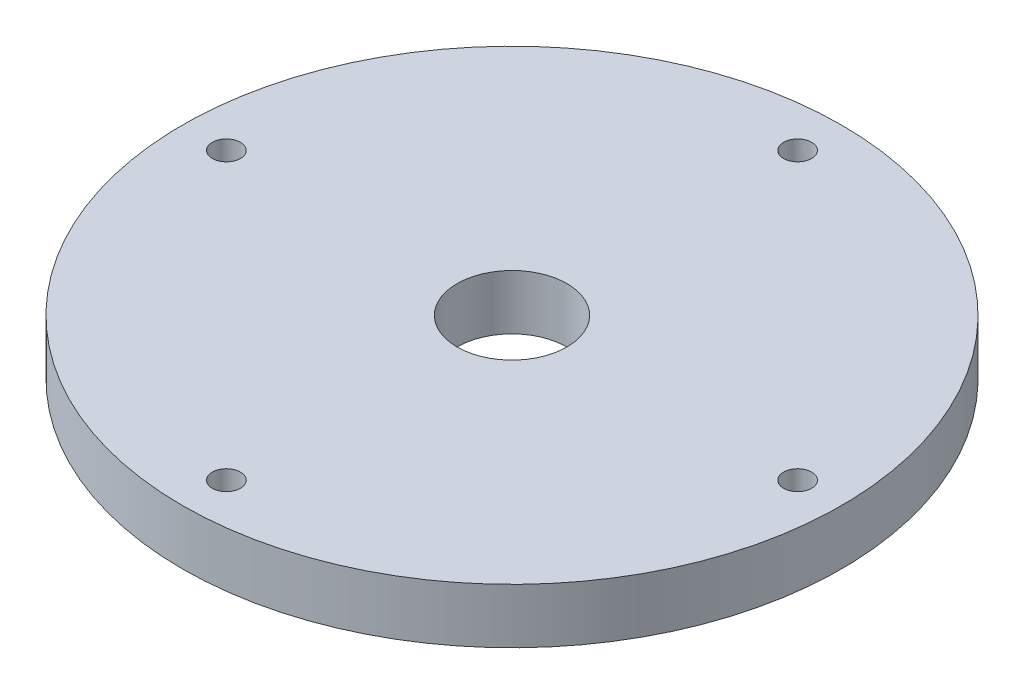
ISO-10303-21;
HEADER;
FILE_DESCRIPTION(('STEP AP214'),'2;1');
FILE_NAME('part.step','',(''),(''),'','','');
FILE_SCHEMA(('AUTOMOTIVE_DESIGN { 1 0 10303 214 1 1 1 1 }'));
ENDSEC;
DATA;
#1=APPLICATION_CONTEXT('core data for automotive mechanical design processes');
#2=APPLICATION_PROTOCOL_DEFINITION('international standard','automotive_design',2000,#1);
#3=PRODUCT_CONTEXT('',#1,'mechanical');
#4=PRODUCT('Part','Part','',(#3));
#5=PRODUCT_RELATED_PRODUCT_CATEGORY('part','',(#4));
#6=PRODUCT_DEFINITION_FORMATION('','',#4);
#7=PRODUCT_DEFINITION_CONTEXT('part definition',#1,'design');
#8=PRODUCT_DEFINITION('design','',#6,#7);
#9=PRODUCT_DEFINITION_SHAPE('','',#8);
#10=(LENGTH_UNIT() NAMED_UNIT(*) SI_UNIT(.MILLI.,.METRE.));
#11=(NAMED_UNIT(*) PLANE_ANGLE_UNIT() SI_UNIT($,.RADIAN.));
#12=(NAMED_UNIT(*) SI_UNIT($,.STERADIAN.) SOLID_ANGLE_UNIT());
#13=UNCERTAINTY_MEASURE_WITH_UNIT(LENGTH_MEASURE(1.E-05),#10,'distance_accuracy_value','');
#14=(GEOMETRIC_REPRESENTATION_CONTEXT(3) GLOBAL_UNCERTAINTY_ASSIGNED_CONTEXT((#13)) GLOBAL_UNIT_ASSIGNED_CONTEXT((#10,
#11,#12)) REPRESENTATION_CONTEXT('',''));
#15=CARTESIAN_POINT('',(0.,0.,0.));
#16=DIRECTION('',(0.,0.,1.));
#17=DIRECTION('',(1.,0.,0.));
#18=AXIS2_PLACEMENT_3D('',#15,#16,#17);
#19=CARTESIAN_POINT('',(0.,6.35,0.));
#20=DIRECTION('',(0.,1.,0.));
#21=DIRECTION('',(0.,0.,1.));
#22=AXIS2_PLACEMENT_3D('',#19,#20,#21);
#23=PLANE('',#22);
#24=CARTESIAN_POINT('',(0.,6.35,33.02));
#25=DIRECTION('',(0.,1.,0.));
#26=DIRECTION('',(0.,0.,1.));
#27=AXIS2_PLACEMENT_3D('',#24,#25,#26);
#28=CIRCLE('',#27,1.6256);
#29=CARTESIAN_POINT('',(0.,6.35,34.6456));
#30=VERTEX_POINT('',#29);
#31=EDGE_CURVE('E59',#30,#30,#28,.T.);
#32=ORIENTED_EDGE('',*,*,#31,.F.);
#33=EDGE_LOOP('',(#32));
#34=FACE_BOUND('',#33,.T.);
#35=CARTESIAN_POINT('',(0.,6.35,0.));
#36=DIRECTION('',(0.,1.,0.));
#37=DIRECTION('',(0.,0.,1.));
#38=AXIS2_PLACEMENT_3D('',#35,#36,#37);
#39=CIRCLE('',#38,6.35);
#40=CARTESIAN_POINT('',(0.,6.35,6.35));
#41=VERTEX_POINT('',#40);
#42=EDGE_CURVE('E47',#41,#41,#39,.T.);
#43=ORIENTED_EDGE('',*,*,#42,.F.);
#44=EDGE_LOOP('',(#43));
#45=FACE_BOUND('',#44,.T.);
#46=CARTESIAN_POINT('',(0.,6.35,0.));
#47=DIRECTION('',(0.,1.,0.));
#48=DIRECTION('',(0.,0.,1.));
#49=AXIS2_PLACEMENT_3D('',#46,#47,#48);
#50=CIRCLE('',#49,38.1);
#51=CARTESIAN_POINT('',(0.,6.35,38.1));
#52=VERTEX_POINT('',#51);
#53=EDGE_CURVE('E10',#52,#52,#50,.T.);
#54=ORIENTED_EDGE('',*,*,#53,.T.);
#55=EDGE_LOOP('',(#54));
#56=FACE_BOUND('',#55,.T.);
#57=CARTESIAN_POINT('',(0.,6.35,-33.02));
#58=DIRECTION('',(0.,1.,0.));
#59=DIRECTION('',(0.,0.,1.));
#60=AXIS2_PLACEMENT_3D('',#57,#58,#59);
#61=CIRCLE('',#60,1.6256);
#62=CARTESIAN_POINT('',(0.,6.35,-31.3944));
#63=VERTEX_POINT('',#62);
#64=EDGE_CURVE('E42',#63,#63,#61,.T.);
#65=ORIENTED_EDGE('',*,*,#64,.F.);
#66=EDGE_LOOP('',(#65));
#67=FACE_BOUND('',#66,.T.);
#68=CARTESIAN_POINT('',(33.02,6.35,0.));
#69=DIRECTION('',(0.,1.,0.));
#70=DIRECTION('',(0.,0.,1.));
#71=AXIS2_PLACEMENT_3D('',#68,#69,#70);
#72=CIRCLE('',#71,1.6256);
#73=CARTESIAN_POINT('',(33.02,6.35,1.62559999999999));
#74=VERTEX_POINT('',#73);
#75=EDGE_CURVE('E53',#74,#74,#72,.T.);
#76=ORIENTED_EDGE('',*,*,#75,.F.);
#77=EDGE_LOOP('',(#76));
#78=FACE_BOUND('',#77,.T.);
#79=CARTESIAN_POINT('',(-33.02,6.35,0.));
#80=DIRECTION('',(0.,1.,0.));
#81=DIRECTION('',(0.,0.,1.));
#82=AXIS2_PLACEMENT_3D('',#79,#80,#81);
#83=CIRCLE('',#82,1.6256);
#84=CARTESIAN_POINT('',(-33.02,6.35,1.6256));
#85=VERTEX_POINT('',#84);
#86=EDGE_CURVE('E65',#85,#85,#83,.T.);
#87=ORIENTED_EDGE('',*,*,#86,.F.);
#88=EDGE_LOOP('',(#87));
#89=FACE_BOUND('',#88,.T.);
#90=ADVANCED_FACE('F31',(#34,#45,#56,#67,#78,#89),#23,.T.);
#91=CARTESIAN_POINT('',(0.,0.,0.));
#92=DIRECTION('',(0.,1.,0.));
#93=DIRECTION('',(0.,0.,1.));
#94=AXIS2_PLACEMENT_3D('',#91,#92,#93);
#95=PLANE('',#94);
#96=CARTESIAN_POINT('',(0.,0.,33.02));
#97=DIRECTION('',(0.,1.,0.));
#98=DIRECTION('',(0.,0.,1.));
#99=AXIS2_PLACEMENT_3D('',#96,#97,#98);
#100=CIRCLE('',#99,1.6256);
#101=CARTESIAN_POINT('',(0.,0.,34.6456));
#102=VERTEX_POINT('',#101);
#103=EDGE_CURVE('E62',#102,#102,#100,.T.);
#104=ORIENTED_EDGE('',*,*,#103,.T.);
#105=EDGE_LOOP('',(#104));
#106=FACE_BOUND('',#105,.T.);
#107=CARTESIAN_POINT('',(0.,0.,0.));
#108=DIRECTION('',(0.,1.,0.));
#109=DIRECTION('',(0.,0.,1.));
#110=AXIS2_PLACEMENT_3D('',#107,#108,#109);
#111=CIRCLE('',#110,6.35);
#112=CARTESIAN_POINT('',(0.,0.,6.35));
#113=VERTEX_POINT('',#112);
#114=EDGE_CURVE('E50',#113,#113,#111,.T.);
#115=ORIENTED_EDGE('',*,*,#114,.T.);
#116=EDGE_LOOP('',(#115));
#117=FACE_BOUND('',#116,.T.);
#118=CARTESIAN_POINT('',(0.,0.,0.));
#119=DIRECTION('',(0.,1.,0.));
#120=DIRECTION('',(0.,0.,1.));
#121=AXIS2_PLACEMENT_3D('',#118,#119,#120);
#122=CIRCLE('',#121,38.1);
#123=CARTESIAN_POINT('',(0.,0.,38.1));
#124=VERTEX_POINT('',#123);
#125=EDGE_CURVE('E35',#124,#124,#122,.T.);
#126=ORIENTED_EDGE('',*,*,#125,.F.);
#127=EDGE_LOOP('',(#126));
#128=FACE_BOUND('',#127,.T.);
#129=CARTESIAN_POINT('',(0.,0.,-33.02));
#130=DIRECTION('',(0.,1.,0.));
#131=DIRECTION('',(0.,0.,1.));
#132=AXIS2_PLACEMENT_3D('',#129,#130,#131);
#133=CIRCLE('',#132,1.6256);
#134=CARTESIAN_POINT('',(0.,0.,-31.3944));
#135=VERTEX_POINT('',#134);
#136=EDGE_CURVE('E44',#135,#135,#133,.T.);
#137=ORIENTED_EDGE('',*,*,#136,.T.);
#138=EDGE_LOOP('',(#137));
#139=FACE_BOUND('',#138,.T.);
#140=CARTESIAN_POINT('',(33.02,0.,0.));
#141=DIRECTION('',(0.,1.,0.));
#142=DIRECTION('',(0.,0.,1.));
#143=AXIS2_PLACEMENT_3D('',#140,#141,#142);
#144=CIRCLE('',#143,1.6256);
#145=CARTESIAN_POINT('',(33.02,0.,1.62559999999999));
#146=VERTEX_POINT('',#145);
#147=EDGE_CURVE('E56',#146,#146,#144,.T.);
#148=ORIENTED_EDGE('',*,*,#147,.T.);
#149=EDGE_LOOP('',(#148));
#150=FACE_BOUND('',#149,.T.);
#151=CARTESIAN_POINT('',(-33.02,0.,0.));
#152=DIRECTION('',(0.,1.,0.));
#153=DIRECTION('',(0.,0.,1.));
#154=AXIS2_PLACEMENT_3D('',#151,#152,#153);
#155=CIRCLE('',#154,1.6256);
#156=CARTESIAN_POINT('',(-33.02,0.,1.6256));
#157=VERTEX_POINT('',#156);
#158=EDGE_CURVE('E68',#157,#157,#155,.T.);
#159=ORIENTED_EDGE('',*,*,#158,.T.);
#160=EDGE_LOOP('',(#159));
#161=FACE_BOUND('',#160,.T.);
#162=ADVANCED_FACE('F78',(#106,#117,#128,#139,#150,#161),#95,.F.);
#163=CARTESIAN_POINT('',(0.,6.35,0.));
#164=DIRECTION('',(0.,-1.,0.));
#165=DIRECTION('',(0.,0.,-1.));
#166=AXIS2_PLACEMENT_3D('',#163,#164,#165);
#167=CYLINDRICAL_SURFACE('',#166,38.1);
#168=ORIENTED_EDGE('',*,*,#53,.F.);
#169=EDGE_LOOP('',(#168));
#170=FACE_BOUND('',#169,.T.);
#171=ORIENTED_EDGE('',*,*,#125,.T.);
#172=EDGE_LOOP('',(#171));
#173=FACE_BOUND('',#172,.T.);
#174=ADVANCED_FACE('F33',(#170,#173),#167,.T.);
#175=CARTESIAN_POINT('',(0.,6.35,-33.02));
#176=DIRECTION('',(0.,-1.,0.));
#177=DIRECTION('',(0.,0.,-1.));
#178=AXIS2_PLACEMENT_3D('',#175,#176,#177);
#179=CYLINDRICAL_SURFACE('',#178,1.6256);
#180=ORIENTED_EDGE('',*,*,#64,.T.);
#181=EDGE_LOOP('',(#180));
#182=FACE_BOUND('',#181,.T.);
#183=ORIENTED_EDGE('',*,*,#136,.F.);
#184=EDGE_LOOP('',(#183));
#185=FACE_BOUND('',#184,.T.);
#186=ADVANCED_FACE('F88',(#182,#185),#179,.F.);
#187=CARTESIAN_POINT('',(0.,6.35,0.));
#188=DIRECTION('',(0.,-1.,0.));
#189=DIRECTION('',(0.,0.,-1.));
#190=AXIS2_PLACEMENT_3D('',#187,#188,#189);
#191=CYLINDRICAL_SURFACE('',#190,6.35);
#192=ORIENTED_EDGE('',*,*,#42,.T.);
#193=EDGE_LOOP('',(#192));
#194=FACE_BOUND('',#193,.T.);
#195=ORIENTED_EDGE('',*,*,#114,.F.);
#196=EDGE_LOOP('',(#195));
#197=FACE_BOUND('',#196,.T.);
#198=ADVANCED_FACE('F91',(#194,#197),#191,.F.);
#199=CARTESIAN_POINT('',(33.02,6.35,0.));
#200=DIRECTION('',(0.,-1.,0.));
#201=DIRECTION('',(0.,0.,-1.));
#202=AXIS2_PLACEMENT_3D('',#199,#200,#201);
#203=CYLINDRICAL_SURFACE('',#202,1.6256);
#204=ORIENTED_EDGE('',*,*,#75,.T.);
#205=EDGE_LOOP('',(#204));
#206=FACE_BOUND('',#205,.T.);
#207=ORIENTED_EDGE('',*,*,#147,.F.);
#208=EDGE_LOOP('',(#207));
#209=FACE_BOUND('',#208,.T.);
#210=ADVANCED_FACE('F95',(#206,#209),#203,.F.);
#211=CARTESIAN_POINT('',(0.,6.35,33.02));
#212=DIRECTION('',(0.,-1.,0.));
#213=DIRECTION('',(0.,0.,-1.));
#214=AXIS2_PLACEMENT_3D('',#211,#212,#213);
#215=CYLINDRICAL_SURFACE('',#214,1.6256);
#216=ORIENTED_EDGE('',*,*,#31,.T.);
#217=EDGE_LOOP('',(#216));
#218=FACE_BOUND('',#217,.T.);
#219=ORIENTED_EDGE('',*,*,#103,.F.);
#220=EDGE_LOOP('',(#219));
#221=FACE_BOUND('',#220,.T.);
#222=ADVANCED_FACE('F99',(#218,#221),#215,.F.);
#223=CARTESIAN_POINT('',(-33.02,6.35,0.));
#224=DIRECTION('',(0.,-1.,0.));
#225=DIRECTION('',(0.,0.,-1.));
#226=AXIS2_PLACEMENT_3D('',#223,#224,#225);
#227=CYLINDRICAL_SURFACE('',#226,1.6256);
#228=ORIENTED_EDGE('',*,*,#86,.T.);
#229=EDGE_LOOP('',(#228));
#230=FACE_BOUND('',#229,.T.);
#231=ORIENTED_EDGE('',*,*,#158,.F.);
#232=EDGE_LOOP('',(#231));
#233=FACE_BOUND('',#232,.T.);
#234=ADVANCED_FACE('F74',(#230,#233),#227,.F.);
#235=CLOSED_SHELL('',(#90,#162,#174,#186,#198,#210,#222,#234));
#236=MANIFOLD_SOLID_BREP('B2',#235);
#237=ADVANCED_BREP_SHAPE_REPRESENTATION('',(#18,#236),#14);
#238=SHAPE_DEFINITION_REPRESENTATION(#9,#237);
ENDSEC;
END-ISO-10303-21;
